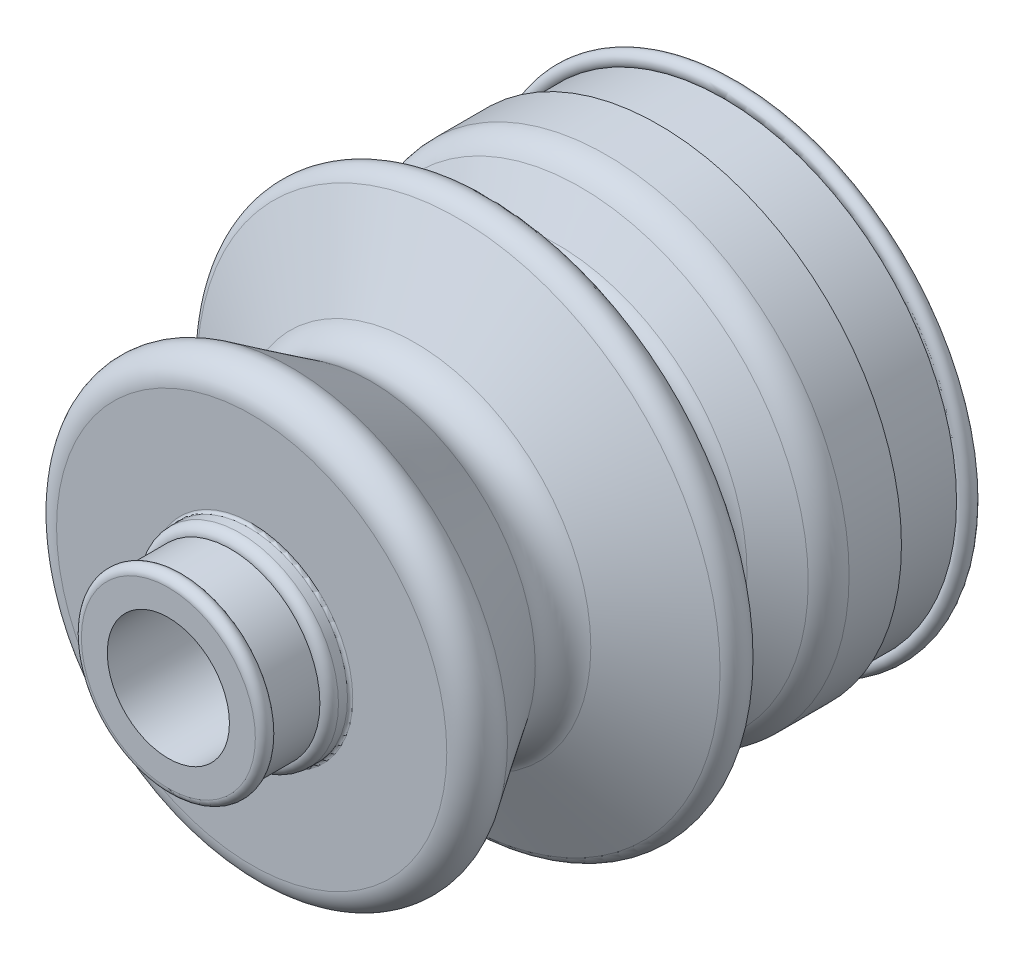
ISO-10303-21;
HEADER;
FILE_DESCRIPTION(('STEP AP214'),'2;1');
FILE_NAME('part.step','',(''),(''),'','','');
FILE_SCHEMA(('AUTOMOTIVE_DESIGN { 1 0 10303 214 1 1 1 1 }'));
ENDSEC;
DATA;
#1=APPLICATION_CONTEXT('core data for automotive mechanical design processes');
#2=APPLICATION_PROTOCOL_DEFINITION('international standard','automotive_design',2000,#1);
#3=PRODUCT_CONTEXT('',#1,'mechanical');
#4=PRODUCT('Part','Part','',(#3));
#5=PRODUCT_RELATED_PRODUCT_CATEGORY('part','',(#4));
#6=PRODUCT_DEFINITION_FORMATION('','',#4);
#7=PRODUCT_DEFINITION_CONTEXT('part definition',#1,'design');
#8=PRODUCT_DEFINITION('design','',#6,#7);
#9=PRODUCT_DEFINITION_SHAPE('','',#8);
#10=(LENGTH_UNIT() NAMED_UNIT(*) SI_UNIT(.MILLI.,.METRE.));
#11=(NAMED_UNIT(*) PLANE_ANGLE_UNIT() SI_UNIT($,.RADIAN.));
#12=(NAMED_UNIT(*) SI_UNIT($,.STERADIAN.) SOLID_ANGLE_UNIT());
#13=UNCERTAINTY_MEASURE_WITH_UNIT(LENGTH_MEASURE(1.E-05),#10,'distance_accuracy_value','');
#14=(GEOMETRIC_REPRESENTATION_CONTEXT(3) GLOBAL_UNCERTAINTY_ASSIGNED_CONTEXT((#13)) GLOBAL_UNIT_ASSIGNED_CONTEXT((#10,
#11,#12)) REPRESENTATION_CONTEXT('',''));
#15=CARTESIAN_POINT('',(0.,0.,0.));
#16=DIRECTION('',(0.,0.,1.));
#17=DIRECTION('',(1.,0.,0.));
#18=AXIS2_PLACEMENT_3D('',#15,#16,#17);
#19=CARTESIAN_POINT('',(0.,0.,-58.5419528979865));
#20=DIRECTION('',(0.,0.,1.));
#21=DIRECTION('',(1.,0.,0.));
#22=AXIS2_PLACEMENT_3D('',#19,#20,#21);
#23=TOROIDAL_SURFACE('',#22,30.80385,2.38125000000001);
#24=CARTESIAN_POINT('',(0.,0.,-60.579));
#25=DIRECTION('',(0.,0.,-1.));
#26=DIRECTION('',(-1.,0.,0.));
#27=AXIS2_PLACEMENT_3D('',#24,#25,#26);
#28=CIRCLE('',#27,29.5706465834145);
#29=CARTESIAN_POINT('',(-29.5706465834145,0.,-60.579));
#30=VERTEX_POINT('',#29);
#31=EDGE_CURVE('E248',#30,#30,#28,.T.);
#32=ORIENTED_EDGE('',*,*,#31,.F.);
#33=EDGE_LOOP('',(#32));
#34=FACE_BOUND('',#33,.T.);
#35=CARTESIAN_POINT('',(0.,0.,-56.4712631971474));
#36=DIRECTION('',(0.,0.,1.));
#37=DIRECTION('',(1.,0.,0.));
#38=AXIS2_PLACEMENT_3D('',#35,#36,#37);
#39=CIRCLE('',#38,29.6280116925192);
#40=CARTESIAN_POINT('',(29.6280116925192,0.,-56.4712631971474));
#41=VERTEX_POINT('',#40);
#42=EDGE_CURVE('E246',#41,#41,#39,.T.);
#43=ORIENTED_EDGE('',*,*,#42,.F.);
#44=EDGE_LOOP('',(#43));
#45=FACE_BOUND('',#44,.T.);
#46=ADVANCED_FACE('F18',(#34,#45),#23,.F.);
#47=CARTESIAN_POINT('',(0.,0.,-64.1757057959729));
#48=DIRECTION('',(0.,0.,-1.));
#49=DIRECTION('',(-1.,0.,0.));
#50=AXIS2_PLACEMENT_3D('',#47,#48,#49);
#51=CONICAL_SURFACE('',#50,35.511806833171,1.02642464065778);
#52=CARTESIAN_POINT('',(0.,0.,-64.1757057959729));
#53=DIRECTION('',(0.,0.,1.));
#54=DIRECTION('',(1.,0.,0.));
#55=AXIS2_PLACEMENT_3D('',#52,#53,#54);
#56=CIRCLE('',#55,35.511806833171);
#57=CARTESIAN_POINT('',(35.511806833171,0.,-64.1757057959729));
#58=VERTEX_POINT('',#57);
#59=EDGE_CURVE('E243',#58,#58,#56,.F.);
#60=ORIENTED_EDGE('',*,*,#59,.F.);
#61=EDGE_LOOP('',(#60));
#62=FACE_BOUND('',#61,.T.);
#63=ORIENTED_EDGE('',*,*,#31,.T.);
#64=EDGE_LOOP('',(#63));
#65=FACE_BOUND('',#64,.T.);
#66=ADVANCED_FACE('F868',(#62,#65),#51,.T.);
#67=CARTESIAN_POINT('',(0.,0.,-50.1009934858603));
#68=DIRECTION('',(0.,0.,1.));
#69=DIRECTION('',(0.,-1.,0.));
#70=AXIS2_PLACEMENT_3D('',#67,#68,#69);
#71=CONICAL_SURFACE('',#70,40.8462649156096,1.05435310009067);
#72=CARTESIAN_POINT('',(0.,0.,-50.1009934858603));
#73=DIRECTION('',(0.,0.,1.));
#74=DIRECTION('',(1.,0.,0.));
#75=AXIS2_PLACEMENT_3D('',#72,#73,#74);
#76=CIRCLE('',#75,40.8462649156096);
#77=CARTESIAN_POINT('',(40.8462649156096,0.,-50.1009934858603));
#78=VERTEX_POINT('',#77);
#79=EDGE_CURVE('E240',#78,#78,#76,.T.);
#80=ORIENTED_EDGE('',*,*,#79,.F.);
#81=EDGE_LOOP('',(#80));
#82=FACE_BOUND('',#81,.T.);
#83=ORIENTED_EDGE('',*,*,#42,.T.);
#84=EDGE_LOOP('',(#83));
#85=FACE_BOUND('',#84,.T.);
#86=ADVANCED_FACE('F236',(#82,#85),#71,.T.);
#87=CARTESIAN_POINT('',(0.,0.,-68.2498));
#88=DIRECTION('',(0.,0.,1.));
#89=DIRECTION('',(1.,0.,0.));
#90=AXIS2_PLACEMENT_3D('',#87,#88,#89);
#91=TOROIDAL_SURFACE('',#90,33.0454,4.7625);
#92=ORIENTED_EDGE('',*,*,#59,.T.);
#93=EDGE_LOOP('',(#92));
#94=FACE_BOUND('',#93,.T.);
#95=CARTESIAN_POINT('',(0.,0.,-68.2498));
#96=DIRECTION('',(0.,0.,1.));
#97=DIRECTION('',(1.,0.,0.));
#98=AXIS2_PLACEMENT_3D('',#95,#96,#97);
#99=CIRCLE('',#98,37.8079);
#100=CARTESIAN_POINT('',(37.8079,0.,-68.2498));
#101=VERTEX_POINT('',#100);
#102=EDGE_CURVE('E221',#101,#101,#99,.F.);
#103=ORIENTED_EDGE('',*,*,#102,.F.);
#104=EDGE_LOOP('',(#103));
#105=FACE_BOUND('',#104,.T.);
#106=ADVANCED_FACE('F231',(#94,#105),#91,.T.);
#107=CARTESIAN_POINT('',(0.,0.,-47.6846366509612));
#108=DIRECTION('',(0.,0.,1.));
#109=DIRECTION('',(1.,0.,0.));
#110=AXIS2_PLACEMENT_3D('',#107,#108,#109);
#111=TOROIDAL_SURFACE('',#110,39.47414,2.77876);
#112=CARTESIAN_POINT('',(0.,0.,-45.212));
#113=DIRECTION('',(0.,0.,-1.));
#114=DIRECTION('',(-1.,0.,0.));
#115=AXIS2_PLACEMENT_3D('',#112,#113,#114);
#116=CIRCLE('',#115,40.7420418613139);
#117=CARTESIAN_POINT('',(-40.7420418613139,0.,-45.212));
#118=VERTEX_POINT('',#117);
#119=EDGE_CURVE('E218',#118,#118,#116,.F.);
#120=ORIENTED_EDGE('',*,*,#119,.F.);
#121=EDGE_LOOP('',(#120));
#122=FACE_BOUND('',#121,.T.);
#123=ORIENTED_EDGE('',*,*,#79,.T.);
#124=EDGE_LOOP('',(#123));
#125=FACE_BOUND('',#124,.T.);
#126=ADVANCED_FACE('F226',(#122,#125),#111,.T.);
#127=CARTESIAN_POINT('',(0.,0.,20.9394893840321));
#128=DIRECTION('',(0.,0.,1.));
#129=DIRECTION('',(1.,0.,0.));
#130=AXIS2_PLACEMENT_3D('',#127,#128,#129);
#131=CYLINDRICAL_SURFACE('',#130,37.8079);
#132=ORIENTED_EDGE('',*,*,#102,.T.);
#133=EDGE_LOOP('',(#132));
#134=FACE_BOUND('',#133,.T.);
#135=CARTESIAN_POINT('',(0.,0.,-76.4032));
#136=DIRECTION('',(0.,0.,1.));
#137=DIRECTION('',(1.,0.,0.));
#138=AXIS2_PLACEMENT_3D('',#135,#136,#137);
#139=CIRCLE('',#138,37.8079);
#140=CARTESIAN_POINT('',(37.8079,0.,-76.4032));
#141=VERTEX_POINT('',#140);
#142=EDGE_CURVE('E217',#141,#141,#139,.T.);
#143=ORIENTED_EDGE('',*,*,#142,.T.);
#144=EDGE_LOOP('',(#143));
#145=FACE_BOUND('',#144,.T.);
#146=ADVANCED_FACE('F230',(#134,#145),#131,.T.);
#147=CARTESIAN_POINT('',(0.,0.,-45.212));
#148=DIRECTION('',(0.,0.,-1.));
#149=DIRECTION('',(-1.,0.,0.));
#150=AXIS2_PLACEMENT_3D('',#147,#148,#149);
#151=CONICAL_SURFACE('',#150,40.7420418613139,1.09698243504543);
#152=ORIENTED_EDGE('',*,*,#119,.T.);
#153=EDGE_LOOP('',(#152));
#154=FACE_BOUND('',#153,.T.);
#155=CARTESIAN_POINT('',(0.,0.,-38.3862750443442));
#156=DIRECTION('',(0.,0.,1.));
#157=DIRECTION('',(1.,0.,0.));
#158=AXIS2_PLACEMENT_3D('',#155,#156,#157);
#159=CIRCLE('',#158,27.4306506490278);
#160=CARTESIAN_POINT('',(27.4306506490278,0.,-38.3862750443442));
#161=VERTEX_POINT('',#160);
#162=EDGE_CURVE('E214',#161,#161,#159,.F.);
#163=ORIENTED_EDGE('',*,*,#162,.T.);
#164=EDGE_LOOP('',(#163));
#165=FACE_BOUND('',#164,.T.);
#166=ADVANCED_FACE('F831',(#154,#165),#151,.T.);
#167=CARTESIAN_POINT('',(0.,37.8079,-76.4032));
#168=DIRECTION('',(0.,0.,1.));
#169=DIRECTION('',(1.,0.,0.));
#170=AXIS2_PLACEMENT_3D('',#167,#168,#169);
#171=PLANE('',#170);
#172=CARTESIAN_POINT('',(0.,0.,-76.4032));
#173=DIRECTION('',(0.,0.,1.));
#174=DIRECTION('',(1.,0.,0.));
#175=AXIS2_PLACEMENT_3D('',#172,#173,#174);
#176=CIRCLE('',#175,36.2331);
#177=CARTESIAN_POINT('',(36.2331,0.,-76.4032));
#178=VERTEX_POINT('',#177);
#179=EDGE_CURVE('E213',#178,#178,#176,.F.);
#180=ORIENTED_EDGE('',*,*,#179,.F.);
#181=EDGE_LOOP('',(#180));
#182=FACE_BOUND('',#181,.T.);
#183=ORIENTED_EDGE('',*,*,#142,.F.);
#184=EDGE_LOOP('',(#183));
#185=FACE_BOUND('',#184,.T.);
#186=ADVANCED_FACE('F822',(#182,#185),#171,.F.);
#187=CARTESIAN_POINT('',(0.,0.,20.9394893840321));
#188=DIRECTION('',(0.,0.,1.));
#189=DIRECTION('',(1.,0.,0.));
#190=AXIS2_PLACEMENT_3D('',#187,#188,#189);
#191=CYLINDRICAL_SURFACE('',#190,36.2331);
#192=ORIENTED_EDGE('',*,*,#179,.T.);
#193=EDGE_LOOP('',(#192));
#194=FACE_BOUND('',#193,.T.);
#195=CARTESIAN_POINT('',(0.,0.,-86.5632));
#196=DIRECTION('',(0.,0.,1.));
#197=DIRECTION('',(1.,0.,0.));
#198=AXIS2_PLACEMENT_3D('',#195,#196,#197);
#199=CIRCLE('',#198,36.2331);
#200=CARTESIAN_POINT('',(36.2331,0.,-86.5632));
#201=VERTEX_POINT('',#200);
#202=EDGE_CURVE('E210',#201,#201,#199,.F.);
#203=ORIENTED_EDGE('',*,*,#202,.F.);
#204=EDGE_LOOP('',(#203));
#205=FACE_BOUND('',#204,.T.);
#206=ADVANCED_FACE('F205',(#194,#205),#191,.T.);
#207=CARTESIAN_POINT('',(0.,0.,-34.1484380054482));
#208=DIRECTION('',(0.,0.,1.));
#209=DIRECTION('',(1.,0.,0.));
#210=AXIS2_PLACEMENT_3D('',#207,#208,#209);
#211=TOROIDAL_SURFACE('',#210,29.6037,4.7625);
#212=ORIENTED_EDGE('',*,*,#162,.F.);
#213=EDGE_LOOP('',(#212));
#214=FACE_BOUND('',#213,.T.);
#215=CARTESIAN_POINT('',(0.,0.,-31.5468));
#216=DIRECTION('',(0.,0.,1.));
#217=DIRECTION('',(1.,0.,0.));
#218=AXIS2_PLACEMENT_3D('',#215,#216,#217);
#219=CIRCLE('',#218,25.6146041201536);
#220=CARTESIAN_POINT('',(25.6146041201536,0.,-31.5468));
#221=VERTEX_POINT('',#220);
#222=EDGE_CURVE('E178',#221,#221,#219,.T.);
#223=ORIENTED_EDGE('',*,*,#222,.F.);
#224=EDGE_LOOP('',(#223));
#225=FACE_BOUND('',#224,.T.);
#226=ADVANCED_FACE('F200',(#214,#225),#211,.F.);
#227=CARTESIAN_POINT('',(0.,0.,-87.5431183716004));
#228=DIRECTION('',(0.,0.,1.));
#229=DIRECTION('',(1.,0.,0.));
#230=AXIS2_PLACEMENT_3D('',#227,#228,#229);
#231=TOROIDAL_SURFACE('',#230,36.909375,1.190625);
#232=ORIENTED_EDGE('',*,*,#202,.T.);
#233=EDGE_LOOP('',(#232));
#234=FACE_BOUND('',#233,.T.);
#235=CARTESIAN_POINT('',(0.,0.,-88.4936));
#236=DIRECTION('',(0.,0.,1.));
#237=DIRECTION('',(1.,0.,0.));
#238=AXIS2_PLACEMENT_3D('',#235,#236,#237);
#239=CIRCLE('',#238,37.6264332714814);
#240=CARTESIAN_POINT('',(37.6264332714814,0.,-88.4936));
#241=VERTEX_POINT('',#240);
#242=EDGE_CURVE('E188',#241,#241,#239,.T.);
#243=ORIENTED_EDGE('',*,*,#242,.T.);
#244=EDGE_LOOP('',(#243));
#245=FACE_BOUND('',#244,.T.);
#246=ADVANCED_FACE('F195',(#234,#245),#231,.T.);
#247=CARTESIAN_POINT('',(0.,0.,-68.9991));
#248=DIRECTION('',(0.,0.,-1.));
#249=DIRECTION('',(-1.,0.,0.));
#250=AXIS2_PLACEMENT_3D('',#247,#248,#249);
#251=CYLINDRICAL_SURFACE('',#250,32.2924332714816);
#252=CARTESIAN_POINT('',(0.,0.,-68.9991));
#253=DIRECTION('',(0.,0.,-1.));
#254=DIRECTION('',(-1.,0.,0.));
#255=AXIS2_PLACEMENT_3D('',#252,#253,#254);
#256=CIRCLE('',#255,32.2924332714816);
#257=CARTESIAN_POINT('',(16.51,27.7528583499626,-68.9991));
#258=VERTEX_POINT('',#257);
#259=CARTESIAN_POINT('',(-16.51,27.7528583499626,-68.9991));
#260=VERTEX_POINT('',#259);
#261=EDGE_CURVE('E292',#258,#260,#256,.F.);
#262=ORIENTED_EDGE('',*,*,#261,.T.);
#263=DIRECTION('',(0.,0.,1.));
#264=VECTOR('',#263,1.);
#265=CARTESIAN_POINT('',(-16.51,27.7528583499626,-68.9991));
#266=LINE('',#265,#264);
#267=CARTESIAN_POINT('',(-16.51,27.7528583499626,-88.4936));
#268=VERTEX_POINT('',#267);
#269=EDGE_CURVE('E186',#260,#268,#266,.F.);
#270=ORIENTED_EDGE('',*,*,#269,.T.);
#271=CARTESIAN_POINT('',(0.,0.,-88.4936));
#272=DIRECTION('',(0.,0.,-1.));
#273=DIRECTION('',(-1.,0.,0.));
#274=AXIS2_PLACEMENT_3D('',#271,#272,#273);
#275=CIRCLE('',#274,32.2924332714816);
#276=CARTESIAN_POINT('',(16.51,27.7528583499626,-88.4936));
#277=VERTEX_POINT('',#276);
#278=EDGE_CURVE('E281',#268,#277,#275,.T.);
#279=ORIENTED_EDGE('',*,*,#278,.T.);
#280=DIRECTION('',(0.,0.,1.));
#281=VECTOR('',#280,1.);
#282=CARTESIAN_POINT('',(16.51,27.7528583499626,-68.9991));
#283=LINE('',#282,#281);
#284=EDGE_CURVE('E153',#277,#258,#283,.T.);
#285=ORIENTED_EDGE('',*,*,#284,.T.);
#286=EDGE_LOOP('',(#262,#270,#279,#285));
#287=FACE_BOUND('',#286,.T.);
#288=ADVANCED_FACE('F199',(#287),#251,.F.);
#289=CARTESIAN_POINT('',(0.,0.,-68.9991));
#290=DIRECTION('',(0.,0.,-1.));
#291=DIRECTION('',(-1.,0.,0.));
#292=AXIS2_PLACEMENT_3D('',#289,#290,#291);
#293=CYLINDRICAL_SURFACE('',#292,32.2924332714816);
#294=CARTESIAN_POINT('',(0.,0.,-68.9991));
#295=DIRECTION('',(0.,0.,-1.));
#296=DIRECTION('',(-1.,0.,0.));
#297=AXIS2_PLACEMENT_3D('',#294,#295,#296);
#298=CIRCLE('',#297,32.2924332714816);
#299=CARTESIAN_POINT('',(15.779680358699,-28.1745085914622,-68.9991));
#300=VERTEX_POINT('',#299);
#301=CARTESIAN_POINT('',(32.2896803586987,0.421650241500067,-68.9991));
#302=VERTEX_POINT('',#301);
#303=EDGE_CURVE('E133',#300,#302,#298,.F.);
#304=ORIENTED_EDGE('',*,*,#303,.T.);
#305=DIRECTION('',(0.,0.,1.));
#306=VECTOR('',#305,1.);
#307=CARTESIAN_POINT('',(32.2896803586987,0.421650241500073,-68.9991));
#308=LINE('',#307,#306);
#309=CARTESIAN_POINT('',(32.2896803586987,0.421650241500068,-88.4936));
#310=VERTEX_POINT('',#309);
#311=EDGE_CURVE('E137',#302,#310,#308,.F.);
#312=ORIENTED_EDGE('',*,*,#311,.T.);
#313=CARTESIAN_POINT('',(0.,0.,-88.4936));
#314=DIRECTION('',(0.,0.,-1.));
#315=DIRECTION('',(-1.,0.,0.));
#316=AXIS2_PLACEMENT_3D('',#313,#314,#315);
#317=CIRCLE('',#316,32.2924332714816);
#318=CARTESIAN_POINT('',(15.779680358699,-28.1745085914622,-88.4936));
#319=VERTEX_POINT('',#318);
#320=EDGE_CURVE('E279',#310,#319,#317,.T.);
#321=ORIENTED_EDGE('',*,*,#320,.T.);
#322=DIRECTION('',(0.,0.,1.));
#323=VECTOR('',#322,1.);
#324=CARTESIAN_POINT('',(15.779680358699,-28.1745085914622,-68.9991));
#325=LINE('',#324,#323);
#326=EDGE_CURVE('E139',#319,#300,#325,.T.);
#327=ORIENTED_EDGE('',*,*,#326,.T.);
#328=EDGE_LOOP('',(#304,#312,#321,#327));
#329=FACE_BOUND('',#328,.T.);
#330=ADVANCED_FACE('F135',(#329),#293,.F.);
#331=CARTESIAN_POINT('',(0.,0.,-68.9991));
#332=DIRECTION('',(0.,0.,-1.));
#333=DIRECTION('',(-1.,0.,0.));
#334=AXIS2_PLACEMENT_3D('',#331,#332,#333);
#335=CYLINDRICAL_SURFACE('',#334,32.2924332714816);
#336=CARTESIAN_POINT('',(0.,0.,-68.9991));
#337=DIRECTION('',(0.,0.,-1.));
#338=DIRECTION('',(-1.,0.,0.));
#339=AXIS2_PLACEMENT_3D('',#336,#337,#338);
#340=CIRCLE('',#339,32.2924332714816);
#341=CARTESIAN_POINT('',(-32.2896803586987,0.421650241499622,-68.9991));
#342=VERTEX_POINT('',#341);
#343=CARTESIAN_POINT('',(-15.7796803586986,-28.1745085914625,-68.9991));
#344=VERTEX_POINT('',#343);
#345=EDGE_CURVE('E276',#342,#344,#340,.F.);
#346=ORIENTED_EDGE('',*,*,#345,.T.);
#347=DIRECTION('',(0.,0.,1.));
#348=VECTOR('',#347,1.);
#349=CARTESIAN_POINT('',(-15.7796803586986,-28.1745085914625,-68.9991));
#350=LINE('',#349,#348);
#351=CARTESIAN_POINT('',(-15.7796803586986,-28.1745085914625,-88.4936));
#352=VERTEX_POINT('',#351);
#353=EDGE_CURVE('E175',#344,#352,#350,.F.);
#354=ORIENTED_EDGE('',*,*,#353,.T.);
#355=CARTESIAN_POINT('',(0.,0.,-88.4936));
#356=DIRECTION('',(0.,0.,-1.));
#357=DIRECTION('',(-1.,0.,0.));
#358=AXIS2_PLACEMENT_3D('',#355,#356,#357);
#359=CIRCLE('',#358,32.2924332714816);
#360=CARTESIAN_POINT('',(-32.2896803586987,0.421650241499629,-88.4936));
#361=VERTEX_POINT('',#360);
#362=EDGE_CURVE('E286',#352,#361,#359,.T.);
#363=ORIENTED_EDGE('',*,*,#362,.T.);
#364=DIRECTION('',(0.,0.,1.));
#365=VECTOR('',#364,1.);
#366=CARTESIAN_POINT('',(-32.2896803586987,0.421650241499623,-68.9991));
#367=LINE('',#366,#365);
#368=EDGE_CURVE('E179',#361,#342,#367,.T.);
#369=ORIENTED_EDGE('',*,*,#368,.T.);
#370=EDGE_LOOP('',(#346,#354,#363,#369));
#371=FACE_BOUND('',#370,.T.);
#372=ADVANCED_FACE('F564',(#371),#335,.F.);
#373=CARTESIAN_POINT('',(0.,0.,-19.1161816712068));
#374=DIRECTION('',(0.,0.,1.));
#375=DIRECTION('',(1.,0.,0.));
#376=AXIS2_PLACEMENT_3D('',#373,#374,#375);
#377=CONICAL_SURFACE('',#376,33.7216965665387,0.57791138784495);
#378=CARTESIAN_POINT('',(0.,0.,-19.1161816712068));
#379=DIRECTION('',(0.,0.,1.));
#380=DIRECTION('',(1.,0.,0.));
#381=AXIS2_PLACEMENT_3D('',#378,#379,#380);
#382=CIRCLE('',#381,33.7216965665387);
#383=CARTESIAN_POINT('',(33.7216965665387,0.,-19.1161816712068));
#384=VERTEX_POINT('',#383);
#385=EDGE_CURVE('E168',#384,#384,#382,.T.);
#386=ORIENTED_EDGE('',*,*,#385,.F.);
#387=EDGE_LOOP('',(#386));
#388=FACE_BOUND('',#387,.T.);
#389=ORIENTED_EDGE('',*,*,#222,.T.);
#390=EDGE_LOOP('',(#389));
#391=FACE_BOUND('',#390,.T.);
#392=ADVANCED_FACE('F776',(#388,#391),#377,.T.);
#393=CARTESIAN_POINT('',(-15.7796803586986,-28.1745085914625,-68.9991));
#394=DIRECTION('',(0.325047941185409,-0.945697539349197,0.));
#395=DIRECTION('',(0.945697539349197,0.325047941185409,0.));
#396=AXIS2_PLACEMENT_3D('',#393,#394,#395);
#397=PLANE('',#396);
#398=DIRECTION('',(0.945697539349198,0.325047941185408,0.));
#399=VECTOR('',#398,1.);
#400=CARTESIAN_POINT('',(-15.7796803586986,-28.1745085914625,-68.9991));
#401=LINE('',#400,#399);
#402=CARTESIAN_POINT('',(-7.91060511882131,-25.4698101024346,-68.9991));
#403=VERTEX_POINT('',#402);
#404=EDGE_CURVE('E174',#344,#403,#401,.T.);
#405=ORIENTED_EDGE('',*,*,#404,.T.);
#406=DIRECTION('',(0.,0.,1.));
#407=VECTOR('',#406,1.);
#408=CARTESIAN_POINT('',(-7.91060511882132,-25.4698101024346,20.9394893840321));
#409=LINE('',#408,#407);
#410=CARTESIAN_POINT('',(-7.91060511882132,-25.4698101024346,-88.4936));
#411=VERTEX_POINT('',#410);
#412=EDGE_CURVE('E164',#403,#411,#409,.F.);
#413=ORIENTED_EDGE('',*,*,#412,.T.);
#414=DIRECTION('',(-0.945697539349197,-0.325047941185409,0.));
#415=VECTOR('',#414,1.);
#416=CARTESIAN_POINT('',(-7.91060511882133,-25.4698101024346,-88.4936));
#417=LINE('',#416,#415);
#418=EDGE_CURVE('E288',#411,#352,#417,.T.);
#419=ORIENTED_EDGE('',*,*,#418,.T.);
#420=ORIENTED_EDGE('',*,*,#353,.F.);
#421=EDGE_LOOP('',(#405,#413,#419,#420));
#422=FACE_BOUND('',#421,.T.);
#423=ADVANCED_FACE('F559',(#422),#397,.F.);
#424=CARTESIAN_POINT('',(15.779680358699,-28.1745085914622,-68.9991));
#425=DIRECTION('',(-0.325047941185396,-0.945697539349202,0.));
#426=DIRECTION('',(0.945697539349202,-0.325047941185396,0.));
#427=AXIS2_PLACEMENT_3D('',#424,#425,#426);
#428=PLANE('',#427);
#429=DIRECTION('',(0.945697539349202,-0.325047941185395,0.));
#430=VECTOR('',#429,1.);
#431=CARTESIAN_POINT('',(7.91060511882168,-25.4698101024345,-68.9991));
#432=LINE('',#431,#430);
#433=CARTESIAN_POINT('',(7.91060511882168,-25.4698101024345,-68.9991));
#434=VERTEX_POINT('',#433);
#435=EDGE_CURVE('E145',#434,#300,#432,.T.);
#436=ORIENTED_EDGE('',*,*,#435,.T.);
#437=ORIENTED_EDGE('',*,*,#326,.F.);
#438=DIRECTION('',(-0.945697539349202,0.325047941185395,0.));
#439=VECTOR('',#438,1.);
#440=CARTESIAN_POINT('',(15.779680358699,-28.1745085914622,-88.4936));
#441=LINE('',#440,#439);
#442=CARTESIAN_POINT('',(7.91060511882168,-25.4698101024345,-88.4936));
#443=VERTEX_POINT('',#442);
#444=EDGE_CURVE('E291',#319,#443,#441,.T.);
#445=ORIENTED_EDGE('',*,*,#444,.T.);
#446=DIRECTION('',(0.,0.,1.));
#447=VECTOR('',#446,1.);
#448=CARTESIAN_POINT('',(7.91060511882167,-25.4698101024345,20.9394893840321));
#449=LINE('',#448,#447);
#450=EDGE_CURVE('E169',#443,#434,#449,.T.);
#451=ORIENTED_EDGE('',*,*,#450,.T.);
#452=EDGE_LOOP('',(#436,#437,#445,#451));
#453=FACE_BOUND('',#452,.T.);
#454=ADVANCED_FACE('F555',(#453),#428,.F.);
#455=CARTESIAN_POINT('',(0.,0.,-68.9991));
#456=DIRECTION('',(0.,0.,1.));
#457=DIRECTION('',(1.,0.,0.));
#458=AXIS2_PLACEMENT_3D('',#455,#456,#457);
#459=PLANE('',#458);
#460=ORIENTED_EDGE('',*,*,#303,.F.);
#461=ORIENTED_EDGE('',*,*,#435,.F.);
#462=CARTESIAN_POINT('',(0.,0.,-68.9991));
#463=DIRECTION('',(0.,0.,1.));
#464=DIRECTION('',(1.,0.,0.));
#465=AXIS2_PLACEMENT_3D('',#462,#463,#464);
#466=CIRCLE('',#465,26.67);
#467=CARTESIAN_POINT('',(26.0128051376845,5.88412005901091,-68.9991));
#468=VERTEX_POINT('',#467);
#469=EDGE_CURVE('E157',#434,#468,#466,.T.);
#470=ORIENTED_EDGE('',*,*,#469,.T.);
#471=DIRECTION('',(-0.754348544188996,0.656474122780131,0.));
#472=VECTOR('',#471,1.);
#473=CARTESIAN_POINT('',(32.2896803586987,0.421650241500073,-68.9991));
#474=LINE('',#473,#472);
#475=EDGE_CURVE('E144',#468,#302,#474,.F.);
#476=ORIENTED_EDGE('',*,*,#475,.T.);
#477=EDGE_LOOP('',(#460,#461,#470,#476));
#478=FACE_BOUND('',#477,.T.);
#479=ADVANCED_FACE('F156',(#478),#459,.F.);
#480=CARTESIAN_POINT('',(32.2896803586987,0.421650241500073,-68.9991));
#481=DIRECTION('',(0.656474122780131,0.754348544188996,0.));
#482=DIRECTION('',(-0.754348544188996,0.656474122780131,0.));
#483=AXIS2_PLACEMENT_3D('',#480,#481,#482);
#484=PLANE('',#483);
#485=ORIENTED_EDGE('',*,*,#475,.F.);
#486=DIRECTION('',(0.,0.,1.));
#487=VECTOR('',#486,1.);
#488=CARTESIAN_POINT('',(26.0128051376845,5.88412005901091,20.9394893840321));
#489=LINE('',#488,#487);
#490=CARTESIAN_POINT('',(26.0128051376845,5.88412005901091,-88.4936));
#491=VERTEX_POINT('',#490);
#492=EDGE_CURVE('E161',#468,#491,#489,.F.);
#493=ORIENTED_EDGE('',*,*,#492,.T.);
#494=DIRECTION('',(0.754348544188996,-0.656474122780131,0.));
#495=VECTOR('',#494,1.);
#496=CARTESIAN_POINT('',(26.0128051376845,5.88412005901091,-88.4936));
#497=LINE('',#496,#495);
#498=EDGE_CURVE('E152',#491,#310,#497,.T.);
#499=ORIENTED_EDGE('',*,*,#498,.T.);
#500=ORIENTED_EDGE('',*,*,#311,.F.);
#501=EDGE_LOOP('',(#485,#493,#499,#500));
#502=FACE_BOUND('',#501,.T.);
#503=ADVANCED_FACE('F149',(#502),#484,.F.);
#504=CARTESIAN_POINT('',(16.51,27.7528583499626,-68.9991));
#505=DIRECTION('',(0.981522063965543,0.191348995160209,0.));
#506=DIRECTION('',(-0.191348995160209,0.981522063965543,0.));
#507=AXIS2_PLACEMENT_3D('',#504,#505,#506);
#508=PLANE('',#507);
#509=DIRECTION('',(-0.191348995160209,0.981522063965542,0.));
#510=VECTOR('',#509,1.);
#511=CARTESIAN_POINT('',(18.1022000188631,19.5856900434238,-68.9991));
#512=LINE('',#511,#510);
#513=CARTESIAN_POINT('',(18.1022000188631,19.5856900434238,-68.9991));
#514=VERTEX_POINT('',#513);
#515=EDGE_CURVE('E185',#514,#258,#512,.T.);
#516=ORIENTED_EDGE('',*,*,#515,.T.);
#517=ORIENTED_EDGE('',*,*,#284,.F.);
#518=DIRECTION('',(0.191348995160209,-0.981522063965542,0.));
#519=VECTOR('',#518,1.);
#520=CARTESIAN_POINT('',(16.51,27.7528583499626,-88.4936));
#521=LINE('',#520,#519);
#522=CARTESIAN_POINT('',(18.1022000188631,19.5856900434238,-88.4936));
#523=VERTEX_POINT('',#522);
#524=EDGE_CURVE('E284',#277,#523,#521,.T.);
#525=ORIENTED_EDGE('',*,*,#524,.T.);
#526=DIRECTION('',(0.,0.,1.));
#527=VECTOR('',#526,1.);
#528=CARTESIAN_POINT('',(18.1022000188631,19.5856900434238,20.9394893840321));
#529=LINE('',#528,#527);
#530=EDGE_CURVE('E269',#523,#514,#529,.T.);
#531=ORIENTED_EDGE('',*,*,#530,.T.);
#532=EDGE_LOOP('',(#516,#517,#525,#531));
#533=FACE_BOUND('',#532,.T.);
#534=ADVANCED_FACE('F540',(#533),#508,.F.);
#535=CARTESIAN_POINT('',(0.,0.,-68.9991));
#536=DIRECTION('',(0.,0.,1.));
#537=DIRECTION('',(1.,0.,0.));
#538=AXIS2_PLACEMENT_3D('',#535,#536,#537);
#539=PLANE('',#538);
#540=ORIENTED_EDGE('',*,*,#261,.F.);
#541=ORIENTED_EDGE('',*,*,#515,.F.);
#542=CARTESIAN_POINT('',(0.,0.,-68.9991));
#543=DIRECTION('',(0.,0.,1.));
#544=DIRECTION('',(1.,0.,0.));
#545=AXIS2_PLACEMENT_3D('',#542,#543,#544);
#546=CIRCLE('',#545,26.67);
#547=CARTESIAN_POINT('',(-18.1022000188631,19.5856900434238,-68.9991));
#548=VERTEX_POINT('',#547);
#549=EDGE_CURVE('E266',#514,#548,#546,.T.);
#550=ORIENTED_EDGE('',*,*,#549,.T.);
#551=DIRECTION('',(-0.191348995160209,-0.981522063965543,0.));
#552=VECTOR('',#551,1.);
#553=CARTESIAN_POINT('',(-16.51,27.7528583499626,-68.9991));
#554=LINE('',#553,#552);
#555=EDGE_CURVE('E189',#548,#260,#554,.F.);
#556=ORIENTED_EDGE('',*,*,#555,.T.);
#557=EDGE_LOOP('',(#540,#541,#550,#556));
#558=FACE_BOUND('',#557,.T.);
#559=ADVANCED_FACE('F575',(#558),#539,.F.);
#560=CARTESIAN_POINT('',(-16.51,27.7528583499626,-68.9991));
#561=DIRECTION('',(-0.981522063965543,0.191348995160209,0.));
#562=DIRECTION('',(-0.191348995160209,-0.981522063965543,0.));
#563=AXIS2_PLACEMENT_3D('',#560,#561,#562);
#564=PLANE('',#563);
#565=ORIENTED_EDGE('',*,*,#555,.F.);
#566=DIRECTION('',(0.,0.,1.));
#567=VECTOR('',#566,1.);
#568=CARTESIAN_POINT('',(-18.1022000188631,19.5856900434238,20.9394893840321));
#569=LINE('',#568,#567);
#570=CARTESIAN_POINT('',(-18.1022000188631,19.5856900434238,-88.4936));
#571=VERTEX_POINT('',#570);
#572=EDGE_CURVE('E265',#548,#571,#569,.F.);
#573=ORIENTED_EDGE('',*,*,#572,.T.);
#574=DIRECTION('',(0.191348995160209,0.981522063965542,0.));
#575=VECTOR('',#574,1.);
#576=CARTESIAN_POINT('',(-18.1022000188631,19.5856900434238,-88.4936));
#577=LINE('',#576,#575);
#578=EDGE_CURVE('E285',#571,#268,#577,.T.);
#579=ORIENTED_EDGE('',*,*,#578,.T.);
#580=ORIENTED_EDGE('',*,*,#269,.F.);
#581=EDGE_LOOP('',(#565,#573,#579,#580));
#582=FACE_BOUND('',#581,.T.);
#583=ADVANCED_FACE('F572',(#582),#564,.F.);
#584=CARTESIAN_POINT('',(0.,37.6264332714814,-88.4936));
#585=DIRECTION('',(0.,0.,1.));
#586=DIRECTION('',(1.,0.,0.));
#587=AXIS2_PLACEMENT_3D('',#584,#585,#586);
#588=PLANE('',#587);
#589=ORIENTED_EDGE('',*,*,#498,.F.);
#590=CARTESIAN_POINT('',(0.,0.,-88.4936));
#591=DIRECTION('',(0.,0.,1.));
#592=DIRECTION('',(1.,0.,0.));
#593=AXIS2_PLACEMENT_3D('',#590,#591,#592);
#594=CIRCLE('',#593,26.67);
#595=EDGE_CURVE('E270',#491,#523,#594,.T.);
#596=ORIENTED_EDGE('',*,*,#595,.T.);
#597=ORIENTED_EDGE('',*,*,#524,.F.);
#598=ORIENTED_EDGE('',*,*,#278,.F.);
#599=ORIENTED_EDGE('',*,*,#578,.F.);
#600=CARTESIAN_POINT('',(0.,0.,-88.4936));
#601=DIRECTION('',(0.,0.,1.));
#602=DIRECTION('',(1.,0.,0.));
#603=AXIS2_PLACEMENT_3D('',#600,#601,#602);
#604=CIRCLE('',#603,26.67);
#605=CARTESIAN_POINT('',(-26.0128051376846,5.88412005901055,-88.4936));
#606=VERTEX_POINT('',#605);
#607=EDGE_CURVE('E262',#571,#606,#604,.T.);
#608=ORIENTED_EDGE('',*,*,#607,.T.);
#609=DIRECTION('',(-0.754348544188987,-0.656474122780141,0.));
#610=VECTOR('',#609,1.);
#611=CARTESIAN_POINT('',(-32.2896803586987,0.421650241499623,-88.4936));
#612=LINE('',#611,#610);
#613=EDGE_CURVE('E182',#606,#361,#612,.T.);
#614=ORIENTED_EDGE('',*,*,#613,.T.);
#615=ORIENTED_EDGE('',*,*,#362,.F.);
#616=ORIENTED_EDGE('',*,*,#418,.F.);
#617=CARTESIAN_POINT('',(0.,0.,-88.4936));
#618=DIRECTION('',(0.,0.,1.));
#619=DIRECTION('',(1.,0.,0.));
#620=AXIS2_PLACEMENT_3D('',#617,#618,#619);
#621=CIRCLE('',#620,26.67);
#622=EDGE_CURVE('E167',#411,#443,#621,.T.);
#623=ORIENTED_EDGE('',*,*,#622,.T.);
#624=ORIENTED_EDGE('',*,*,#444,.F.);
#625=ORIENTED_EDGE('',*,*,#320,.F.);
#626=EDGE_LOOP('',(#589,#596,#597,#598,#599,#608,#614,#615,#616,#623,#624,#625));
#627=FACE_BOUND('',#626,.T.);
#628=ORIENTED_EDGE('',*,*,#242,.F.);
#629=EDGE_LOOP('',(#628));
#630=FACE_BOUND('',#629,.T.);
#631=ADVANCED_FACE('F548',(#627,#630),#588,.F.);
#632=CARTESIAN_POINT('',(-32.2896803586987,0.421650241499623,-68.9991));
#633=DIRECTION('',(-0.656474122780141,0.754348544188987,0.));
#634=DIRECTION('',(-0.754348544188987,-0.656474122780141,0.));
#635=AXIS2_PLACEMENT_3D('',#632,#633,#634);
#636=PLANE('',#635);
#637=DIRECTION('',(-0.754348544188986,-0.656474122780142,0.));
#638=VECTOR('',#637,1.);
#639=CARTESIAN_POINT('',(-26.0128051376846,5.88412005901057,-68.9991));
#640=LINE('',#639,#638);
#641=CARTESIAN_POINT('',(-26.0128051376846,5.88412005901056,-68.9991));
#642=VERTEX_POINT('',#641);
#643=EDGE_CURVE('E181',#642,#342,#640,.T.);
#644=ORIENTED_EDGE('',*,*,#643,.T.);
#645=ORIENTED_EDGE('',*,*,#368,.F.);
#646=ORIENTED_EDGE('',*,*,#613,.F.);
#647=DIRECTION('',(0.,0.,1.));
#648=VECTOR('',#647,1.);
#649=CARTESIAN_POINT('',(-26.0128051376846,5.88412005901055,20.9394893840321));
#650=LINE('',#649,#648);
#651=EDGE_CURVE('E261',#606,#642,#650,.T.);
#652=ORIENTED_EDGE('',*,*,#651,.T.);
#653=EDGE_LOOP('',(#644,#645,#646,#652));
#654=FACE_BOUND('',#653,.T.);
#655=ADVANCED_FACE('F567',(#654),#636,.F.);
#656=CARTESIAN_POINT('',(0.,0.,-68.9991));
#657=DIRECTION('',(0.,0.,1.));
#658=DIRECTION('',(1.,0.,0.));
#659=AXIS2_PLACEMENT_3D('',#656,#657,#658);
#660=PLANE('',#659);
#661=ORIENTED_EDGE('',*,*,#345,.F.);
#662=ORIENTED_EDGE('',*,*,#643,.F.);
#663=CARTESIAN_POINT('',(0.,0.,-68.9991));
#664=DIRECTION('',(0.,0.,1.));
#665=DIRECTION('',(1.,0.,0.));
#666=AXIS2_PLACEMENT_3D('',#663,#664,#665);
#667=CIRCLE('',#666,26.67);
#668=EDGE_CURVE('E258',#642,#403,#667,.T.);
#669=ORIENTED_EDGE('',*,*,#668,.T.);
#670=ORIENTED_EDGE('',*,*,#404,.F.);
#671=EDGE_LOOP('',(#661,#662,#669,#670));
#672=FACE_BOUND('',#671,.T.);
#673=ADVANCED_FACE('F505',(#672),#660,.F.);
#674=CARTESIAN_POINT('',(0.,0.,-16.94815));
#675=DIRECTION('',(0.,0.,1.));
#676=DIRECTION('',(1.,0.,0.));
#677=AXIS2_PLACEMENT_3D('',#674,#675,#676);
#678=TOROIDAL_SURFACE('',#677,30.39745,3.96875);
#679=CARTESIAN_POINT('',(0.,0.,-12.9794));
#680=DIRECTION('',(0.,0.,-1.));
#681=DIRECTION('',(1.,0.,0.));
#682=AXIS2_PLACEMENT_3D('',#679,#680,#681);
#683=CIRCLE('',#682,30.39745);
#684=CARTESIAN_POINT('',(30.39745,0.,-12.9794));
#685=VERTEX_POINT('',#684);
#686=CARTESIAN_POINT('',(-30.39745,0.,-12.9794));
#687=VERTEX_POINT('',#686);
#688=EDGE_CURVE('E260',#685,#687,#683,.T.);
#689=ORIENTED_EDGE('',*,*,#688,.T.);
#690=CARTESIAN_POINT('',(0.,0.,-12.9794));
#691=DIRECTION('',(0.,0.,-1.));
#692=DIRECTION('',(-1.,0.,0.));
#693=AXIS2_PLACEMENT_3D('',#690,#691,#692);
#694=CIRCLE('',#693,30.39745);
#695=EDGE_CURVE('E477',#687,#685,#694,.T.);
#696=ORIENTED_EDGE('',*,*,#695,.T.);
#697=EDGE_LOOP('',(#689,#696));
#698=FACE_BOUND('',#697,.T.);
#699=ORIENTED_EDGE('',*,*,#385,.T.);
#700=EDGE_LOOP('',(#699));
#701=FACE_BOUND('',#700,.T.);
#702=ADVANCED_FACE('F500',(#698,#701),#678,.T.);
#703=CARTESIAN_POINT('',(0.,0.,20.9394893840321));
#704=DIRECTION('',(0.,0.,1.));
#705=DIRECTION('',(1.,0.,0.));
#706=AXIS2_PLACEMENT_3D('',#703,#704,#705);
#707=CYLINDRICAL_SURFACE('',#706,26.67);
#708=ORIENTED_EDGE('',*,*,#469,.F.);
#709=ORIENTED_EDGE('',*,*,#450,.F.);
#710=ORIENTED_EDGE('',*,*,#622,.F.);
#711=ORIENTED_EDGE('',*,*,#412,.F.);
#712=ORIENTED_EDGE('',*,*,#668,.F.);
#713=ORIENTED_EDGE('',*,*,#651,.F.);
#714=ORIENTED_EDGE('',*,*,#607,.F.);
#715=ORIENTED_EDGE('',*,*,#572,.F.);
#716=ORIENTED_EDGE('',*,*,#549,.F.);
#717=ORIENTED_EDGE('',*,*,#530,.F.);
#718=ORIENTED_EDGE('',*,*,#595,.F.);
#719=ORIENTED_EDGE('',*,*,#492,.F.);
#720=EDGE_LOOP('',(#708,#709,#710,#711,#712,#713,#714,#715,#716,#717,#718,#719));
#721=FACE_BOUND('',#720,.T.);
#722=CARTESIAN_POINT('',(0.,0.,-64.9424725710333));
#723=DIRECTION('',(0.,0.,1.));
#724=DIRECTION('',(1.,0.,0.));
#725=AXIS2_PLACEMENT_3D('',#722,#723,#724);
#726=CIRCLE('',#725,26.67);
#727=CARTESIAN_POINT('',(26.67,0.,-64.9424725710333));
#728=VERTEX_POINT('',#727);
#729=EDGE_CURVE('E489',#728,#728,#726,.F.);
#730=ORIENTED_EDGE('',*,*,#729,.F.);
#731=EDGE_LOOP('',(#730));
#732=FACE_BOUND('',#731,.T.);
#733=ADVANCED_FACE('F504',(#721,#732),#707,.F.);
#734=CARTESIAN_POINT('',(0.,15.7512311223976,-12.9794));
#735=DIRECTION('',(0.,0.,-1.));
#736=DIRECTION('',(-1.,0.,0.));
#737=AXIS2_PLACEMENT_3D('',#734,#735,#736);
#738=PLANE('',#737);
#739=ORIENTED_EDGE('',*,*,#688,.F.);
#740=ORIENTED_EDGE('',*,*,#695,.F.);
#741=EDGE_LOOP('',(#739,#740));
#742=FACE_BOUND('',#741,.T.);
#743=CARTESIAN_POINT('',(0.,0.,-12.9794));
#744=DIRECTION('',(0.,0.,1.));
#745=DIRECTION('',(-1.,0.,0.));
#746=AXIS2_PLACEMENT_3D('',#743,#744,#745);
#747=CIRCLE('',#746,15.7512311223976);
#748=CARTESIAN_POINT('',(15.7512311223976,0.,-12.9794));
#749=VERTEX_POINT('',#748);
#750=CARTESIAN_POINT('',(-15.7512311223976,0.,-12.9794));
#751=VERTEX_POINT('',#750);
#752=EDGE_CURVE('E415',#749,#751,#747,.F.);
#753=ORIENTED_EDGE('',*,*,#752,.T.);
#754=CARTESIAN_POINT('',(0.,0.,-12.9794));
#755=DIRECTION('',(0.,0.,1.));
#756=DIRECTION('',(1.,0.,0.));
#757=AXIS2_PLACEMENT_3D('',#754,#755,#756);
#758=CIRCLE('',#757,15.7512311223976);
#759=EDGE_CURVE('E456',#751,#749,#758,.F.);
#760=ORIENTED_EDGE('',*,*,#759,.T.);
#761=EDGE_LOOP('',(#753,#760));
#762=FACE_BOUND('',#761,.T.);
#763=ADVANCED_FACE('F433',(#742,#762),#738,.F.);
#764=CARTESIAN_POINT('',(0.,0.,-12.5697688776024));
#765=DIRECTION('',(0.,0.,1.));
#766=DIRECTION('',(1.,0.,0.));
#767=AXIS2_PLACEMENT_3D('',#764,#765,#766);
#768=TOROIDAL_SURFACE('',#767,15.7512311223976,0.409631122397623);
#769=CARTESIAN_POINT('',(0.,0.,-12.5697688776024));
#770=DIRECTION('',(0.,0.,1.));
#771=DIRECTION('',(1.,0.,0.));
#772=AXIS2_PLACEMENT_3D('',#769,#770,#771);
#773=CIRCLE('',#772,15.3416);
#774=CARTESIAN_POINT('',(15.3416,0.,-12.5697688776024));
#775=VERTEX_POINT('',#774);
#776=EDGE_CURVE('E444',#775,#775,#773,.T.);
#777=ORIENTED_EDGE('',*,*,#776,.F.);
#778=EDGE_LOOP('',(#777));
#779=FACE_BOUND('',#778,.T.);
#780=ORIENTED_EDGE('',*,*,#752,.F.);
#781=ORIENTED_EDGE('',*,*,#759,.F.);
#782=EDGE_LOOP('',(#780,#781));
#783=FACE_BOUND('',#782,.T.);
#784=ADVANCED_FACE('F421',(#779,#783),#768,.F.);
#785=CARTESIAN_POINT('',(0.,0.,-59.1484362557092));
#786=DIRECTION('',(0.,0.,1.));
#787=DIRECTION('',(1.,0.,0.));
#788=AXIS2_PLACEMENT_3D('',#785,#786,#787);
#789=TOROIDAL_SURFACE('',#788,32.3826673419419,8.13667161577658);
#790=ORIENTED_EDGE('',*,*,#729,.T.);
#791=EDGE_LOOP('',(#790));
#792=FACE_BOUND('',#791,.T.);
#793=CARTESIAN_POINT('',(0.,0.,-52.0729414047284));
#794=DIRECTION('',(0.,0.,1.));
#795=DIRECTION('',(1.,0.,0.));
#796=AXIS2_PLACEMENT_3D('',#793,#794,#795);
#797=CIRCLE('',#796,28.3648572920852);
#798=CARTESIAN_POINT('',(28.3648572920852,0.,-52.0729414047284));
#799=VERTEX_POINT('',#798);
#800=EDGE_CURVE('E997',#799,#799,#797,.T.);
#801=ORIENTED_EDGE('',*,*,#800,.T.);
#802=EDGE_LOOP('',(#801));
#803=FACE_BOUND('',#802,.T.);
#804=ADVANCED_FACE('F432',(#792,#803),#789,.T.);
#805=CARTESIAN_POINT('',(0.,0.,20.9394893840321));
#806=DIRECTION('',(0.,0.,1.));
#807=DIRECTION('',(1.,0.,0.));
#808=AXIS2_PLACEMENT_3D('',#805,#806,#807);
#809=CYLINDRICAL_SURFACE('',#808,15.3416);
#810=CARTESIAN_POINT('',(0.,0.,-11.1633));
#811=DIRECTION('',(0.,0.,1.));
#812=DIRECTION('',(1.,0.,0.));
#813=AXIS2_PLACEMENT_3D('',#810,#811,#812);
#814=CIRCLE('',#813,15.3416);
#815=CARTESIAN_POINT('',(15.3416,0.,-11.1633));
#816=VERTEX_POINT('',#815);
#817=EDGE_CURVE('E998',#816,#816,#814,.T.);
#818=ORIENTED_EDGE('',*,*,#817,.F.);
#819=EDGE_LOOP('',(#818));
#820=FACE_BOUND('',#819,.T.);
#821=ORIENTED_EDGE('',*,*,#776,.T.);
#822=EDGE_LOOP('',(#821));
#823=FACE_BOUND('',#822,.T.);
#824=ADVANCED_FACE('F686',(#820,#823),#809,.T.);
#825=CARTESIAN_POINT('',(0.,0.,-48.2379765994997));
#826=DIRECTION('',(0.,0.,1.));
#827=DIRECTION('',(1.,0.,0.));
#828=AXIS2_PLACEMENT_3D('',#825,#826,#827);
#829=CONICAL_SURFACE('',#828,35.1183556895655,1.05435310009067);
#830=ORIENTED_EDGE('',*,*,#800,.F.);
#831=EDGE_LOOP('',(#830));
#832=FACE_BOUND('',#831,.T.);
#833=CARTESIAN_POINT('',(0.,0.,-48.2379765994997));
#834=DIRECTION('',(0.,0.,1.));
#835=DIRECTION('',(1.,0.,0.));
#836=AXIS2_PLACEMENT_3D('',#833,#834,#835);
#837=CIRCLE('',#836,35.1183556895655);
#838=CARTESIAN_POINT('',(35.1183556895655,0.,-48.2379765994997));
#839=VERTEX_POINT('',#838);
#840=EDGE_CURVE('E1001',#839,#839,#837,.T.);
#841=ORIENTED_EDGE('',*,*,#840,.T.);
#842=EDGE_LOOP('',(#841));
#843=FACE_BOUND('',#842,.T.);
#844=ADVANCED_FACE('F678',(#832,#843),#829,.F.);
#845=CARTESIAN_POINT('',(0.,0.,-11.1633));
#846=DIRECTION('',(0.,0.,1.));
#847=DIRECTION('',(1.,0.,0.));
#848=AXIS2_PLACEMENT_3D('',#845,#846,#847);
#849=TOROIDAL_SURFACE('',#848,13.8938,1.4478);
#850=CARTESIAN_POINT('',(0.,0.,-9.7155));
#851=DIRECTION('',(0.,0.,1.));
#852=DIRECTION('',(1.,0.,0.));
#853=AXIS2_PLACEMENT_3D('',#850,#851,#852);
#854=CIRCLE('',#853,13.8938);
#855=CARTESIAN_POINT('',(13.8938,0.,-9.7155));
#856=VERTEX_POINT('',#855);
#857=EDGE_CURVE('E1008',#856,#856,#854,.T.);
#858=ORIENTED_EDGE('',*,*,#857,.F.);
#859=EDGE_LOOP('',(#858));
#860=FACE_BOUND('',#859,.T.);
#861=ORIENTED_EDGE('',*,*,#817,.T.);
#862=EDGE_LOOP('',(#861));
#863=FACE_BOUND('',#862,.T.);
#864=ADVANCED_FACE('F670',(#860,#863),#849,.T.);
#865=CARTESIAN_POINT('',(0.,0.,-46.6281030236726));
#866=DIRECTION('',(0.,0.,1.));
#867=DIRECTION('',(1.,0.,0.));
#868=AXIS2_PLACEMENT_3D('',#865,#866,#867);
#869=TOROIDAL_SURFACE('',#868,34.2041911868437,1.85132106026561);
#870=ORIENTED_EDGE('',*,*,#840,.F.);
#871=EDGE_LOOP('',(#870));
#872=FACE_BOUND('',#871,.T.);
#873=CARTESIAN_POINT('',(0.,0.,-44.9807335832354));
#874=DIRECTION('',(0.,0.,-1.));
#875=DIRECTION('',(-1.,0.,0.));
#876=AXIS2_PLACEMENT_3D('',#873,#874,#875);
#877=CIRCLE('',#876,35.0489181219516);
#878=CARTESIAN_POINT('',(-35.0489181219516,0.,-44.9807335832354));
#879=VERTEX_POINT('',#878);
#880=EDGE_CURVE('E1014',#879,#879,#877,.F.);
#881=ORIENTED_EDGE('',*,*,#880,.T.);
#882=EDGE_LOOP('',(#881));
#883=FACE_BOUND('',#882,.T.);
#884=ADVANCED_FACE('F662',(#872,#883),#869,.F.);
#885=CARTESIAN_POINT('',(0.,0.,20.9394893840321));
#886=DIRECTION('',(0.,0.,1.));
#887=DIRECTION('',(1.,0.,0.));
#888=AXIS2_PLACEMENT_3D('',#885,#886,#887);
#889=CYLINDRICAL_SURFACE('',#888,13.8938);
#890=CARTESIAN_POINT('',(0.,0.,-2.33729378223058));
#891=DIRECTION('',(0.,0.,1.));
#892=DIRECTION('',(1.,0.,0.));
#893=AXIS2_PLACEMENT_3D('',#890,#891,#892);
#894=CIRCLE('',#893,13.8938);
#895=CARTESIAN_POINT('',(13.8938,0.,-2.33729378223058));
#896=VERTEX_POINT('',#895);
#897=EDGE_CURVE('E1017',#896,#896,#894,.T.);
#898=ORIENTED_EDGE('',*,*,#897,.F.);
#899=EDGE_LOOP('',(#898));
#900=FACE_BOUND('',#899,.T.);
#901=ORIENTED_EDGE('',*,*,#857,.T.);
#902=EDGE_LOOP('',(#901));
#903=FACE_BOUND('',#902,.T.);
#904=ADVANCED_FACE('F655',(#900,#903),#889,.T.);
#905=CARTESIAN_POINT('',(0.,0.,-44.9807335832354));
#906=DIRECTION('',(0.,0.,-1.));
#907=DIRECTION('',(-1.,0.,0.));
#908=AXIS2_PLACEMENT_3D('',#905,#906,#907);
#909=CONICAL_SURFACE('',#908,35.0489181219516,1.09698243504543);
#910=CARTESIAN_POINT('',(0.,0.,-39.8753486350587));
#911=DIRECTION('',(0.,0.,1.));
#912=DIRECTION('',(1.,0.,0.));
#913=AXIS2_PLACEMENT_3D('',#910,#911,#912);
#914=CIRCLE('',#913,25.0924993128131);
#915=CARTESIAN_POINT('',(25.0924993128131,0.,-39.8753486350587));
#916=VERTEX_POINT('',#915);
#917=EDGE_CURVE('E400',#916,#916,#914,.F.);
#918=ORIENTED_EDGE('',*,*,#917,.F.);
#919=EDGE_LOOP('',(#918));
#920=FACE_BOUND('',#919,.T.);
#921=ORIENTED_EDGE('',*,*,#880,.F.);
#922=EDGE_LOOP('',(#921));
#923=FACE_BOUND('',#922,.T.);
#924=ADVANCED_FACE('F649',(#920,#923),#909,.F.);
#925=CARTESIAN_POINT('',(0.,0.,-1.1938));
#926=DIRECTION('',(0.,0.,1.));
#927=DIRECTION('',(1.,0.,0.));
#928=AXIS2_PLACEMENT_3D('',#925,#926,#927);
#929=TOROIDAL_SURFACE('',#928,13.5509,1.1938);
#930=CARTESIAN_POINT('',(0.,0.,0.));
#931=DIRECTION('',(0.,0.,-1.));
#932=DIRECTION('',(1.,0.,0.));
#933=AXIS2_PLACEMENT_3D('',#930,#931,#932);
#934=CIRCLE('',#933,13.5509);
#935=CARTESIAN_POINT('',(13.5509,0.,0.));
#936=VERTEX_POINT('',#935);
#937=CARTESIAN_POINT('',(-13.5509,0.,0.));
#938=VERTEX_POINT('',#937);
#939=EDGE_CURVE('E395',#936,#938,#934,.T.);
#940=ORIENTED_EDGE('',*,*,#939,.T.);
#941=CARTESIAN_POINT('',(0.,0.,0.));
#942=DIRECTION('',(0.,0.,-1.));
#943=DIRECTION('',(-1.,0.,0.));
#944=AXIS2_PLACEMENT_3D('',#941,#942,#943);
#945=CIRCLE('',#944,13.5509);
#946=EDGE_CURVE('E257',#938,#936,#945,.T.);
#947=ORIENTED_EDGE('',*,*,#946,.T.);
#948=EDGE_LOOP('',(#940,#947));
#949=FACE_BOUND('',#948,.T.);
#950=ORIENTED_EDGE('',*,*,#897,.T.);
#951=EDGE_LOOP('',(#950));
#952=FACE_BOUND('',#951,.T.);
#953=ADVANCED_FACE('F375',(#949,#952),#929,.T.);
#954=CARTESIAN_POINT('',(0.,13.5509,0.));
#955=DIRECTION('',(0.,0.,-1.));
#956=DIRECTION('',(-1.,0.,0.));
#957=AXIS2_PLACEMENT_3D('',#954,#955,#956);
#958=PLANE('',#957);
#959=ORIENTED_EDGE('',*,*,#939,.F.);
#960=ORIENTED_EDGE('',*,*,#946,.F.);
#961=EDGE_LOOP('',(#959,#960));
#962=FACE_BOUND('',#961,.T.);
#963=CARTESIAN_POINT('',(0.,0.,0.));
#964=DIRECTION('',(0.,0.,1.));
#965=DIRECTION('',(1.,0.,0.));
#966=AXIS2_PLACEMENT_3D('',#963,#964,#965);
#967=CIRCLE('',#966,9.5123);
#968=CARTESIAN_POINT('',(9.5123,0.,0.));
#969=VERTEX_POINT('',#968);
#970=EDGE_CURVE('E253',#969,#969,#967,.F.);
#971=ORIENTED_EDGE('',*,*,#970,.T.);
#972=EDGE_LOOP('',(#971));
#973=FACE_BOUND('',#972,.T.);
#974=ADVANCED_FACE('F370',(#962,#973),#958,.F.);
#975=CARTESIAN_POINT('',(0.,0.,-33.611546594684));
#976=DIRECTION('',(0.,0.,1.));
#977=DIRECTION('',(1.,0.,0.));
#978=AXIS2_PLACEMENT_3D('',#975,#976,#977);
#979=TOROIDAL_SURFACE('',#978,28.3044092644049,7.03928842555385);
#980=ORIENTED_EDGE('',*,*,#917,.T.);
#981=EDGE_LOOP('',(#980));
#982=FACE_BOUND('',#981,.T.);
#983=CARTESIAN_POINT('',(0.,0.,-29.6692712418705));
#984=DIRECTION('',(0.,0.,1.));
#985=DIRECTION('',(1.,0.,0.));
#986=AXIS2_PLACEMENT_3D('',#983,#984,#985);
#987=CIRCLE('',#986,22.472595945999);
#988=CARTESIAN_POINT('',(22.472595945999,0.,-29.6692712418705));
#989=VERTEX_POINT('',#988);
#990=EDGE_CURVE('E256',#989,#989,#987,.T.);
#991=ORIENTED_EDGE('',*,*,#990,.T.);
#992=EDGE_LOOP('',(#991));
#993=FACE_BOUND('',#992,.T.);
#994=ADVANCED_FACE('F365',(#982,#993),#979,.T.);
#995=CARTESIAN_POINT('',(0.,0.,20.9394893840321));
#996=DIRECTION('',(0.,0.,1.));
#997=DIRECTION('',(1.,0.,0.));
#998=AXIS2_PLACEMENT_3D('',#995,#996,#997);
#999=CYLINDRICAL_SURFACE('',#998,9.5123);
#1000=CARTESIAN_POINT('',(0.,0.,-13.8304322209127));
#1001=DIRECTION('',(0.,0.,1.));
#1002=DIRECTION('',(1.,0.,0.));
#1003=AXIS2_PLACEMENT_3D('',#1000,#1001,#1002);
#1004=CIRCLE('',#1003,9.5123);
#1005=CARTESIAN_POINT('',(9.5123,0.,-13.8304322209127));
#1006=VERTEX_POINT('',#1005);
#1007=EDGE_CURVE('E356',#1006,#1006,#1004,.T.);
#1008=ORIENTED_EDGE('',*,*,#1007,.F.);
#1009=EDGE_LOOP('',(#1008));
#1010=FACE_BOUND('',#1009,.T.);
#1011=ORIENTED_EDGE('',*,*,#970,.F.);
#1012=EDGE_LOOP('',(#1011));
#1013=FACE_BOUND('',#1012,.T.);
#1014=ADVANCED_FACE('F369',(#1010,#1013),#999,.F.);
#1015=CARTESIAN_POINT('',(0.,0.,-18.1028503159592));
#1016=DIRECTION('',(0.,0.,1.));
#1017=DIRECTION('',(1.,0.,0.));
#1018=AXIS2_PLACEMENT_3D('',#1015,#1016,#1017);
#1019=CONICAL_SURFACE('',#1018,30.2914360986105,0.594432754548924);
#1020=ORIENTED_EDGE('',*,*,#990,.F.);
#1021=EDGE_LOOP('',(#1020));
#1022=FACE_BOUND('',#1021,.T.);
#1023=CARTESIAN_POINT('',(0.,0.,-18.1028503159592));
#1024=DIRECTION('',(0.,0.,1.));
#1025=DIRECTION('',(1.,0.,0.));
#1026=AXIS2_PLACEMENT_3D('',#1023,#1024,#1025);
#1027=CIRCLE('',#1026,30.2914360986105);
#1028=CARTESIAN_POINT('',(30.2914360986105,0.,-18.1028503159592));
#1029=VERTEX_POINT('',#1028);
#1030=EDGE_CURVE('E347',#1029,#1029,#1027,.T.);
#1031=ORIENTED_EDGE('',*,*,#1030,.T.);
#1032=EDGE_LOOP('',(#1031));
#1033=FACE_BOUND('',#1032,.T.);
#1034=ADVANCED_FACE('F614',(#1022,#1033),#1019,.F.);
#1035=CARTESIAN_POINT('',(0.,0.,-17.3373432899564));
#1036=DIRECTION('',(0.,0.,1.));
#1037=DIRECTION('',(1.,0.,0.));
#1038=AXIS2_PLACEMENT_3D('',#1035,#1036,#1037);
#1039=TOROIDAL_SURFACE('',#1038,29.1590205086161,1.36688188053033);
#1040=ORIENTED_EDGE('',*,*,#1030,.F.);
#1041=EDGE_LOOP('',(#1040));
#1042=FACE_BOUND('',#1041,.T.);
#1043=CARTESIAN_POINT('',(0.,0.,-15.970461409426));
#1044=DIRECTION('',(0.,0.,1.));
#1045=DIRECTION('',(-1.,0.,0.));
#1046=AXIS2_PLACEMENT_3D('',#1043,#1044,#1045);
#1047=CIRCLE('',#1046,29.1590205086161);
#1048=CARTESIAN_POINT('',(-29.1590205086161,0.,-15.970461409426));
#1049=VERTEX_POINT('',#1048);
#1050=CARTESIAN_POINT('',(29.1590205086161,0.,-15.970461409426));
#1051=VERTEX_POINT('',#1050);
#1052=EDGE_CURVE('E355',#1049,#1051,#1047,.T.);
#1053=ORIENTED_EDGE('',*,*,#1052,.T.);
#1054=CARTESIAN_POINT('',(0.,0.,-15.970461409426));
#1055=DIRECTION('',(0.,0.,1.));
#1056=DIRECTION('',(1.,0.,0.));
#1057=AXIS2_PLACEMENT_3D('',#1054,#1055,#1056);
#1058=CIRCLE('',#1057,29.1590205086161);
#1059=EDGE_CURVE('E343',#1051,#1049,#1058,.T.);
#1060=ORIENTED_EDGE('',*,*,#1059,.T.);
#1061=EDGE_LOOP('',(#1053,#1060));
#1062=FACE_BOUND('',#1061,.T.);
#1063=ADVANCED_FACE('F318',(#1042,#1062),#1039,.F.);
#1064=CARTESIAN_POINT('',(0.,0.,-14.0130347515554));
#1065=DIRECTION('',(0.,0.,1.));
#1066=DIRECTION('',(1.,0.,0.));
#1067=AXIS2_PLACEMENT_3D('',#1064,#1065,#1066);
#1068=TOROIDAL_SURFACE('',#1067,11.4611908221718,1.9574266578706);
#1069=ORIENTED_EDGE('',*,*,#1007,.T.);
#1070=EDGE_LOOP('',(#1069));
#1071=FACE_BOUND('',#1070,.T.);
#1072=CARTESIAN_POINT('',(0.,0.,-15.970461409426));
#1073=DIRECTION('',(0.,0.,-1.));
#1074=DIRECTION('',(-1.,0.,0.));
#1075=AXIS2_PLACEMENT_3D('',#1072,#1073,#1074);
#1076=CIRCLE('',#1075,11.4611908221718);
#1077=CARTESIAN_POINT('',(-11.4611908221718,0.,-15.970461409426));
#1078=VERTEX_POINT('',#1077);
#1079=CARTESIAN_POINT('',(11.4611908221718,0.,-15.970461409426));
#1080=VERTEX_POINT('',#1079);
#1081=EDGE_CURVE('E11',#1078,#1080,#1076,.T.);
#1082=ORIENTED_EDGE('',*,*,#1081,.T.);
#1083=CARTESIAN_POINT('',(0.,0.,-15.970461409426));
#1084=DIRECTION('',(0.,0.,-1.));
#1085=DIRECTION('',(1.,0.,0.));
#1086=AXIS2_PLACEMENT_3D('',#1083,#1084,#1085);
#1087=CIRCLE('',#1086,11.4611908221718);
#1088=EDGE_CURVE('E30',#1080,#1078,#1087,.T.);
#1089=ORIENTED_EDGE('',*,*,#1088,.T.);
#1090=EDGE_LOOP('',(#1082,#1089));
#1091=FACE_BOUND('',#1090,.T.);
#1092=ADVANCED_FACE('F306',(#1071,#1091),#1068,.T.);
#1093=CARTESIAN_POINT('',(0.,29.1590205086161,-15.970461409426));
#1094=DIRECTION('',(0.,0.,1.));
#1095=DIRECTION('',(1.,0.,0.));
#1096=AXIS2_PLACEMENT_3D('',#1093,#1094,#1095);
#1097=PLANE('',#1096);
#1098=ORIENTED_EDGE('',*,*,#1088,.F.);
#1099=ORIENTED_EDGE('',*,*,#1081,.F.);
#1100=EDGE_LOOP('',(#1098,#1099));
#1101=FACE_BOUND('',#1100,.T.);
#1102=ORIENTED_EDGE('',*,*,#1052,.F.);
#1103=ORIENTED_EDGE('',*,*,#1059,.F.);
#1104=EDGE_LOOP('',(#1102,#1103));
#1105=FACE_BOUND('',#1104,.T.);
#1106=ADVANCED_FACE('F317',(#1101,#1105),#1097,.F.);
#1107=CLOSED_SHELL('',(#46,#66,#86,#106,#126,#146,#166,#186,#206,#226,#246,#288,#330,#372,#392,
#423,#454,#479,#503,#534,#559,#583,#631,#655,#673,#702,#733,#763,#784,#804,#824,#844,#864,#884,
#904,#924,#953,#974,#994,#1014,#1034,#1063,#1092,#1106));
#1108=MANIFOLD_SOLID_BREP('B1',#1107);
#1109=ADVANCED_BREP_SHAPE_REPRESENTATION('',(#18,#1108),#14);
#1110=SHAPE_DEFINITION_REPRESENTATION(#9,#1109);
ENDSEC;
END-ISO-10303-21;
